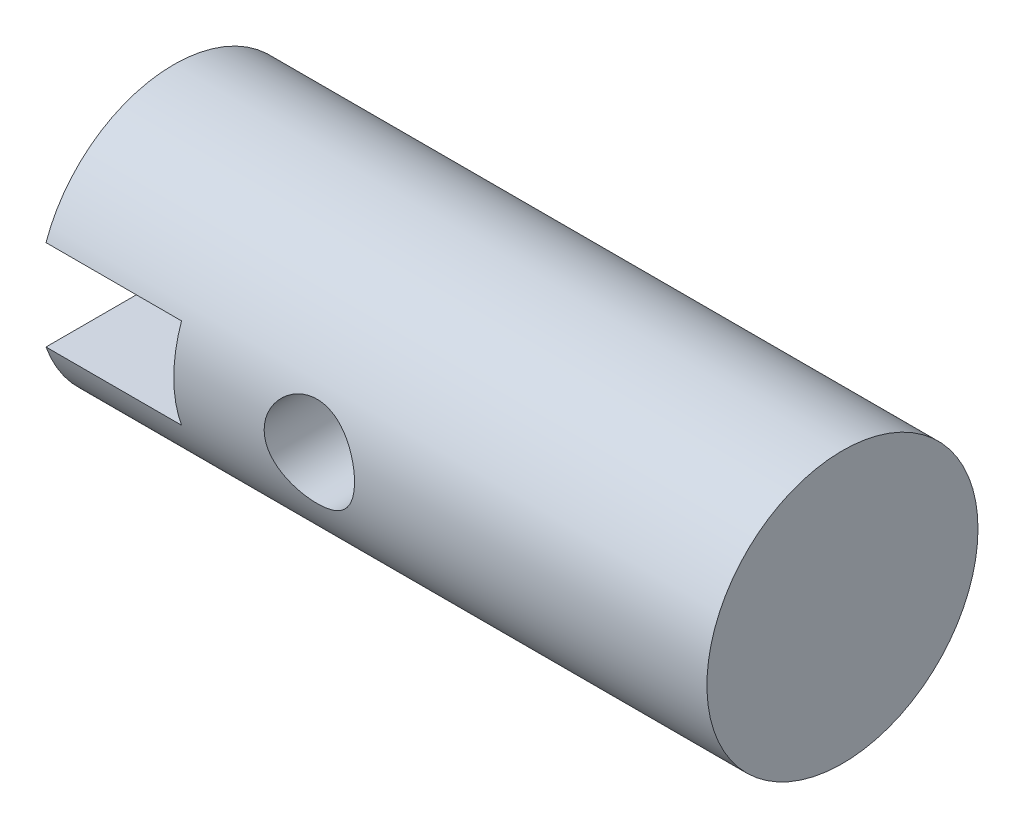
ISO-10303-21;
HEADER;
FILE_DESCRIPTION(('STEP AP214'),'2;1');
FILE_NAME('part.step','',(''),(''),'','','');
FILE_SCHEMA(('AUTOMOTIVE_DESIGN { 1 0 10303 214 1 1 1 1 }'));
ENDSEC;
DATA;
#1=APPLICATION_CONTEXT('core data for automotive mechanical design processes');
#2=APPLICATION_PROTOCOL_DEFINITION('international standard','automotive_design',2000,#1);
#3=PRODUCT_CONTEXT('',#1,'mechanical');
#4=PRODUCT('Part','Part','',(#3));
#5=PRODUCT_RELATED_PRODUCT_CATEGORY('part','',(#4));
#6=PRODUCT_DEFINITION_FORMATION('','',#4);
#7=PRODUCT_DEFINITION_CONTEXT('part definition',#1,'design');
#8=PRODUCT_DEFINITION('design','',#6,#7);
#9=PRODUCT_DEFINITION_SHAPE('','',#8);
#10=(LENGTH_UNIT() NAMED_UNIT(*) SI_UNIT(.MILLI.,.METRE.));
#11=(NAMED_UNIT(*) PLANE_ANGLE_UNIT() SI_UNIT($,.RADIAN.));
#12=(NAMED_UNIT(*) SI_UNIT($,.STERADIAN.) SOLID_ANGLE_UNIT());
#13=UNCERTAINTY_MEASURE_WITH_UNIT(LENGTH_MEASURE(1.E-05),#10,'distance_accuracy_value','');
#14=(GEOMETRIC_REPRESENTATION_CONTEXT(3) GLOBAL_UNCERTAINTY_ASSIGNED_CONTEXT((#13)) GLOBAL_UNIT_ASSIGNED_CONTEXT((#10,
#11,#12)) REPRESENTATION_CONTEXT('',''));
#15=CARTESIAN_POINT('',(0.,0.,0.));
#16=DIRECTION('',(0.,0.,1.));
#17=DIRECTION('',(1.,0.,0.));
#18=AXIS2_PLACEMENT_3D('',#15,#16,#17);
#19=CARTESIAN_POINT('',(0.,0.,0.));
#20=DIRECTION('',(1.,0.,0.));
#21=DIRECTION('',(0.,0.,-1.));
#22=AXIS2_PLACEMENT_3D('',#19,#20,#21);
#23=PLANE('',#22);
#24=CARTESIAN_POINT('',(0.,0.,0.));
#25=DIRECTION('',(1.,0.,0.));
#26=DIRECTION('',(0.,0.,-1.));
#27=AXIS2_PLACEMENT_3D('',#24,#25,#26);
#28=CIRCLE('',#27,9.525);
#29=CARTESIAN_POINT('',(0.,3.175,-8.98025612106915));
#30=VERTEX_POINT('',#29);
#31=CARTESIAN_POINT('',(0.,3.175,8.98025612106914));
#32=VERTEX_POINT('',#31);
#33=EDGE_CURVE('E166',#30,#32,#28,.T.);
#34=ORIENTED_EDGE('',*,*,#33,.F.);
#35=DIRECTION('',(0.,0.,1.));
#36=VECTOR('',#35,1.);
#37=CARTESIAN_POINT('',(0.,3.175,0.));
#38=LINE('',#37,#36);
#39=EDGE_CURVE('E187',#30,#32,#38,.T.);
#40=ORIENTED_EDGE('',*,*,#39,.T.);
#41=EDGE_LOOP('',(#34,#40));
#42=FACE_BOUND('',#41,.T.);
#43=ADVANCED_FACE('F25',(#42),#23,.F.);
#44=CARTESIAN_POINT('',(46.99,0.,0.));
#45=DIRECTION('',(-1.,0.,0.));
#46=DIRECTION('',(0.,0.,1.));
#47=AXIS2_PLACEMENT_3D('',#44,#45,#46);
#48=CYLINDRICAL_SURFACE('',#47,9.525);
#49=CARTESIAN_POINT('',(22.225,0.,9.525));
#50=CARTESIAN_POINT('',(22.225000805598,-0.173238677165346,9.52500048580498));
#51=CARTESIAN_POINT('',(22.2107751550461,-0.346472492659896,9.52023018186455));
#52=CARTESIAN_POINT('',(22.1544225795053,-0.687837590771687,9.50167042395416));
#53=CARTESIAN_POINT('',(22.1122927579622,-0.855968341777246,9.48788003366834));
#54=CARTESIAN_POINT('',(22.0017364022556,-1.18215660666814,9.45277852602955));
#55=CARTESIAN_POINT('',(21.9333538266918,-1.34023044718816,9.43147998545459));
#56=CARTESIAN_POINT('',(21.7724317762382,-1.6426654243569,9.3835361515256));
#57=CARTESIAN_POINT('',(21.6798875361167,-1.78702384834389,9.35688980370195));
#58=CARTESIAN_POINT('',(21.4699030695735,-2.06292981819569,9.30002249856541));
#59=CARTESIAN_POINT('',(21.3517758312229,-2.19393674844713,9.26971591772517));
#60=CARTESIAN_POINT('',(21.0954392838067,-2.43469379932911,9.20941499436411));
#61=CARTESIAN_POINT('',(20.957225564102,-2.54443923892904,9.17942072197493));
#62=CARTESIAN_POINT('',(20.6597722592512,-2.74264419157345,9.12219830615344));
#63=CARTESIAN_POINT('',(20.5000423763505,-2.83040092485177,9.0950744970031));
#64=CARTESIAN_POINT('',(20.1670409000941,-2.97757492456176,9.04796594704059));
#65=CARTESIAN_POINT('',(19.9937734580083,-3.03700083920298,9.02797902810367));
#66=CARTESIAN_POINT('',(19.6447625217479,-3.12379824029159,8.99830887880273));
#67=CARTESIAN_POINT('',(19.4692993630472,-3.15218269826287,8.98830104068516));
#68=CARTESIAN_POINT('',(19.1158375805551,-3.17925806658696,8.97876209798686));
#69=CARTESIAN_POINT('',(18.9378397572483,-3.17795815259498,8.97922775597168));
#70=CARTESIAN_POINT('',(18.5930011983402,-3.14648819425835,8.99029872650972));
#71=CARTESIAN_POINT('',(18.4260223207321,-3.11764017430521,9.00043970379417));
#72=CARTESIAN_POINT('',(18.0994258927483,-3.0340495670469,9.02895888275449));
#73=CARTESIAN_POINT('',(17.9398092262437,-2.97930387942919,9.04733807064542));
#74=CARTESIAN_POINT('',(17.6294645200471,-2.84460650934117,9.09059367841715));
#75=CARTESIAN_POINT('',(17.4789210191343,-2.76426310464556,9.11556996393148));
#76=CARTESIAN_POINT('',(17.1930348662119,-2.58092291251246,9.16916373477931));
#77=CARTESIAN_POINT('',(17.0576966219865,-2.47791958175572,9.19778227084722));
#78=CARTESIAN_POINT('',(16.7986341758396,-2.2458341312661,9.25726270107577));
#79=CARTESIAN_POINT('',(16.6758851949337,-2.11567125149229,9.28816371201626));
#80=CARTESIAN_POINT('',(16.4537032283437,-1.83622813465495,9.34742029378842));
#81=CARTESIAN_POINT('',(16.3542724788277,-1.68694606622309,9.37577562033364));
#82=CARTESIAN_POINT('',(16.1807642467537,-1.3714336714219,9.42711817702495));
#83=CARTESIAN_POINT('',(16.1069480649932,-1.20504990262187,9.45004936275525));
#84=CARTESIAN_POINT('',(15.9886549226906,-0.861279339682313,9.4875530068358));
#85=CARTESIAN_POINT('',(15.9441677705306,-0.68389639114198,9.50212836854242));
#86=CARTESIAN_POINT('',(15.887523260379,-0.331418658755542,9.52079715951823));
#87=CARTESIAN_POINT('',(15.8740481058765,-0.156557979570889,9.52531755822087));
#88=CARTESIAN_POINT('',(15.8760562386751,0.192960847123751,9.52464766056077));
#89=CARTESIAN_POINT('',(15.8915346379361,0.367619023839887,9.51945900331475));
#90=CARTESIAN_POINT('',(15.9499678070617,0.706500575516009,9.50023578476806));
#91=CARTESIAN_POINT('',(15.9921137042071,0.870879661700626,9.48646180908036));
#92=CARTESIAN_POINT('',(16.1016741861819,1.19016766849014,9.45171613685472));
#93=CARTESIAN_POINT('',(16.1690919933102,1.34507537851482,9.43074352248193));
#94=CARTESIAN_POINT('',(16.3292486210945,1.64556534104864,9.38304356837145));
#95=CARTESIAN_POINT('',(16.4226068336741,1.79079512051444,9.35617936849621));
#96=CARTESIAN_POINT('',(16.6312664262928,2.06395583568049,9.29974181184133));
#97=CARTESIAN_POINT('',(16.7465745079009,2.19188146775095,9.27016762910403));
#98=CARTESIAN_POINT('',(17.0020575344459,2.432851712285,9.20993992337912));
#99=CARTESIAN_POINT('',(17.1431242954928,2.54495607735532,9.17929841452584));
#100=CARTESIAN_POINT('',(17.4427247277996,2.74401763337735,9.121774152107));
#101=CARTESIAN_POINT('',(17.6012585446632,2.83097461468096,9.09489142987857));
#102=CARTESIAN_POINT('',(17.9313618235454,2.97687025407194,9.04819093937643));
#103=CARTESIAN_POINT('',(18.1029041013608,3.03586556962394,9.02835890517708));
#104=CARTESIAN_POINT('',(18.4543022138901,3.12386556696095,8.99829392572977));
#105=CARTESIAN_POINT('',(18.6341542651588,3.15288375947876,8.98805665630055));
#106=CARTESIAN_POINT('',(18.9871257799299,3.17905219686556,8.97883201925513));
#107=CARTESIAN_POINT('',(19.1601164304107,3.17776306695417,8.97929370817293));
#108=CARTESIAN_POINT('',(19.5032791128776,3.1471942816996,8.99005281690779));
#109=CARTESIAN_POINT('',(19.6734513120074,3.11791629228101,9.00034965132723));
#110=CARTESIAN_POINT('',(20.0029307300328,3.03330550668567,9.02920864668031));
#111=CARTESIAN_POINT('',(20.1623829193893,2.97847812359926,9.04761011221366));
#112=CARTESIAN_POINT('',(20.469947017029,2.84473448628719,9.09054566248638));
#113=CARTESIAN_POINT('',(20.6180563990219,2.76581288515833,9.11508110823773));
#114=CARTESIAN_POINT('',(20.9057356520052,2.58210269895239,9.16885482792697));
#115=CARTESIAN_POINT('',(21.0446508935274,2.47633567077754,9.19825159463785));
#116=CARTESIAN_POINT('',(21.3032651574948,2.24359115395569,9.25777156199328));
#117=CARTESIAN_POINT('',(21.4229587278096,2.11660766813346,9.28789496596782));
#118=CARTESIAN_POINT('',(21.6444335090181,1.83909194322319,9.34688346918603));
#119=CARTESIAN_POINT('',(21.7453348041094,1.68783480536164,9.3756537721899));
#120=CARTESIAN_POINT('',(21.9201696116008,1.36955960976604,9.42740021973043));
#121=CARTESIAN_POINT('',(21.9941100183025,1.20254559507021,9.45037784507677));
#122=CARTESIAN_POINT('',(22.1098161831515,0.865167329863101,9.4870751034262));
#123=CARTESIAN_POINT('',(22.1528718303862,0.6952861306226,9.50116249441509));
#124=CARTESIAN_POINT('',(22.2104593911499,0.350267320832535,9.52012342428904));
#125=CARTESIAN_POINT('',(22.2249991856015,0.17513117618077,9.52499950888798));
#126=CARTESIAN_POINT('',(22.225,0.,9.525));
#127=B_SPLINE_CURVE_WITH_KNOTS('',3,(#49,#50,#51,#52,#53,#54,#55,#56,#57,#58,#59,#60,#61,#62,
#63,#64,#65,#66,#67,#68,#69,#70,#71,#72,#73,#74,#75,#76,#77,#78,#79,#80,#81,#82,#83,#84,#85,#86,
#87,#88,#89,#90,#91,#92,#93,#94,#95,#96,#97,#98,#99,#100,#101,#102,#103,#104,#105,#106,#107,
#108,#109,#110,#111,#112,#113,#114,#115,#116,#117,#118,#119,#120,#121,#122,#123,#124,#125,#126),
.UNSPECIFIED.,.T.,.F.,(4,2,2,2,2,2,2,2,2,2,2,2,2,2,2,2,2,2,2,2,2,2,2,2,2,2,2,2,2,2,2,2,2,2,2,2,
2,2,4),(0.,0.519071561632585,1.03819701322438,1.55645698636312,2.07481924951214,2.6093637259775,
3.14402575687908,3.69406121814518,4.24392866899745,4.77526114230342,5.30642937910265,
5.81332424300314,6.32027980466154,6.83539943417539,7.35066800622307,7.89283745951089,
8.43505888444012,8.98265937939884,9.53006948685135,10.0537512658116,10.5773446429626,
11.0857715158083,11.5942632377703,12.1161301950386,12.638156741095,13.1839024764639,
13.7296527614611,14.2742924389999,14.8186865394104,15.3351123975402,15.8515075194061,
16.3580948898032,16.8647947620873,17.3936046174648,17.92256420318,18.4721392315144,
19.0215736265905,19.5464607283686,20.0712027467109),.UNSPECIFIED.);
#128=CARTESIAN_POINT('',(22.225,0.,9.525));
#129=VERTEX_POINT('',#128);
#130=EDGE_CURVE('E91',#129,#129,#127,.T.);
#131=ORIENTED_EDGE('',*,*,#130,.T.);
#132=EDGE_LOOP('',(#131));
#133=FACE_BOUND('',#132,.T.);
#134=CARTESIAN_POINT('',(22.225,0.,-9.525));
#135=CARTESIAN_POINT('',(22.225000805598,0.173238677165346,-9.52500048580498));
#136=CARTESIAN_POINT('',(22.2107751550461,0.346472492659896,-9.52023018186455));
#137=CARTESIAN_POINT('',(22.1544225795053,0.687837590771686,-9.50167042395416));
#138=CARTESIAN_POINT('',(22.1122927579622,0.855968341777245,-9.48788003366834));
#139=CARTESIAN_POINT('',(22.0017364022556,1.18215660666814,-9.45277852602955));
#140=CARTESIAN_POINT('',(21.9333538266918,1.34023044718816,-9.43147998545459));
#141=CARTESIAN_POINT('',(21.7724317762382,1.6426654243569,-9.3835361515256));
#142=CARTESIAN_POINT('',(21.6798875361167,1.78702384834389,-9.35688980370195));
#143=CARTESIAN_POINT('',(21.4699030695735,2.06292981819569,-9.30002249856541));
#144=CARTESIAN_POINT('',(21.3517758312229,2.19393674844713,-9.26971591772517));
#145=CARTESIAN_POINT('',(21.0954392838067,2.43469379932911,-9.20941499436411));
#146=CARTESIAN_POINT('',(20.957225564102,2.54443923892904,-9.17942072197493));
#147=CARTESIAN_POINT('',(20.6597722592512,2.74264419157345,-9.12219830615344));
#148=CARTESIAN_POINT('',(20.5000423763505,2.83040092485177,-9.0950744970031));
#149=CARTESIAN_POINT('',(20.1670409000941,2.97757492456176,-9.04796594704059));
#150=CARTESIAN_POINT('',(19.9937734580083,3.03700083920298,-9.02797902810367));
#151=CARTESIAN_POINT('',(19.6447625217479,3.12379824029159,-8.99830887880273));
#152=CARTESIAN_POINT('',(19.4692993630472,3.15218269826287,-8.98830104068516));
#153=CARTESIAN_POINT('',(19.1158375805551,3.17925806658696,-8.97876209798686));
#154=CARTESIAN_POINT('',(18.9378397572483,3.17795815259498,-8.97922775597168));
#155=CARTESIAN_POINT('',(18.5930011983402,3.14648819425835,-8.99029872650972));
#156=CARTESIAN_POINT('',(18.4260223207321,3.11764017430521,-9.00043970379417));
#157=CARTESIAN_POINT('',(18.0994258927483,3.0340495670469,-9.02895888275449));
#158=CARTESIAN_POINT('',(17.9398092262437,2.97930387942919,-9.04733807064542));
#159=CARTESIAN_POINT('',(17.6294645200471,2.84460650934117,-9.09059367841715));
#160=CARTESIAN_POINT('',(17.4789210191343,2.76426310464556,-9.11556996393148));
#161=CARTESIAN_POINT('',(17.1930348662119,2.58092291251246,-9.16916373477931));
#162=CARTESIAN_POINT('',(17.0576966219865,2.47791958175572,-9.19778227084722));
#163=CARTESIAN_POINT('',(16.7986341758396,2.2458341312661,-9.25726270107577));
#164=CARTESIAN_POINT('',(16.6758851949337,2.11567125149229,-9.28816371201626));
#165=CARTESIAN_POINT('',(16.4537032283437,1.83622813465495,-9.34742029378842));
#166=CARTESIAN_POINT('',(16.3542724788277,1.68694606622309,-9.37577562033364));
#167=CARTESIAN_POINT('',(16.1807642467537,1.3714336714219,-9.42711817702495));
#168=CARTESIAN_POINT('',(16.1069480649932,1.20504990262187,-9.45004936275525));
#169=CARTESIAN_POINT('',(15.9886549226906,0.861279339682313,-9.4875530068358));
#170=CARTESIAN_POINT('',(15.9441677705306,0.683896391141979,-9.50212836854242));
#171=CARTESIAN_POINT('',(15.887523260379,0.331418658755542,-9.52079715951823));
#172=CARTESIAN_POINT('',(15.8740481058765,0.156557979570889,-9.52531755822087));
#173=CARTESIAN_POINT('',(15.8760562386751,-0.192960847123751,-9.52464766056077));
#174=CARTESIAN_POINT('',(15.8915346379361,-0.367619023839888,-9.51945900331475));
#175=CARTESIAN_POINT('',(15.9499678070617,-0.706500575516009,-9.50023578476806));
#176=CARTESIAN_POINT('',(15.9921137042071,-0.870879661700626,-9.48646180908036));
#177=CARTESIAN_POINT('',(16.1016741861819,-1.19016766849014,-9.45171613685472));
#178=CARTESIAN_POINT('',(16.1690919933102,-1.34507537851482,-9.43074352248193));
#179=CARTESIAN_POINT('',(16.3292486210945,-1.64556534104864,-9.38304356837145));
#180=CARTESIAN_POINT('',(16.4226068336741,-1.79079512051444,-9.35617936849621));
#181=CARTESIAN_POINT('',(16.6312664262928,-2.06395583568049,-9.29974181184133));
#182=CARTESIAN_POINT('',(16.7465745079009,-2.19188146775095,-9.27016762910403));
#183=CARTESIAN_POINT('',(17.0020575344459,-2.432851712285,-9.20993992337912));
#184=CARTESIAN_POINT('',(17.1431242954928,-2.54495607735532,-9.17929841452584));
#185=CARTESIAN_POINT('',(17.4427247277996,-2.74401763337735,-9.121774152107));
#186=CARTESIAN_POINT('',(17.6012585446632,-2.83097461468096,-9.09489142987857));
#187=CARTESIAN_POINT('',(17.9313618235454,-2.97687025407194,-9.04819093937643));
#188=CARTESIAN_POINT('',(18.1029041013608,-3.03586556962394,-9.02835890517708));
#189=CARTESIAN_POINT('',(18.4543022138901,-3.12386556696095,-8.99829392572977));
#190=CARTESIAN_POINT('',(18.6341542651588,-3.15288375947876,-8.98805665630055));
#191=CARTESIAN_POINT('',(18.9871257799299,-3.17905219686556,-8.97883201925513));
#192=CARTESIAN_POINT('',(19.1601164304107,-3.17776306695417,-8.97929370817293));
#193=CARTESIAN_POINT('',(19.5032791128776,-3.1471942816996,-8.99005281690779));
#194=CARTESIAN_POINT('',(19.6734513120074,-3.11791629228101,-9.00034965132723));
#195=CARTESIAN_POINT('',(20.0029307300328,-3.03330550668567,-9.02920864668031));
#196=CARTESIAN_POINT('',(20.1623829193893,-2.97847812359926,-9.04761011221366));
#197=CARTESIAN_POINT('',(20.469947017029,-2.84473448628719,-9.09054566248638));
#198=CARTESIAN_POINT('',(20.6180563990219,-2.76581288515833,-9.11508110823773));
#199=CARTESIAN_POINT('',(20.9057356520052,-2.58210269895239,-9.16885482792697));
#200=CARTESIAN_POINT('',(21.0446508935274,-2.47633567077754,-9.19825159463785));
#201=CARTESIAN_POINT('',(21.3032651574948,-2.24359115395568,-9.25777156199328));
#202=CARTESIAN_POINT('',(21.4229587278096,-2.11660766813345,-9.28789496596782));
#203=CARTESIAN_POINT('',(21.6444335090181,-1.83909194322318,-9.34688346918603));
#204=CARTESIAN_POINT('',(21.7453348041094,-1.68783480536164,-9.3756537721899));
#205=CARTESIAN_POINT('',(21.9201696116008,-1.36955960976603,-9.42740021973043));
#206=CARTESIAN_POINT('',(21.9941100183025,-1.20254559507021,-9.45037784507677));
#207=CARTESIAN_POINT('',(22.1098161831515,-0.865167329863098,-9.4870751034262));
#208=CARTESIAN_POINT('',(22.1528718303862,-0.695286130622597,-9.50116249441509));
#209=CARTESIAN_POINT('',(22.2104593911499,-0.350267320832534,-9.52012342428904));
#210=CARTESIAN_POINT('',(22.2249991856015,-0.17513117618077,-9.52499950888798));
#211=CARTESIAN_POINT('',(22.225,0.,-9.525));
#212=B_SPLINE_CURVE_WITH_KNOTS('',3,(#134,#135,#136,#137,#138,#139,#140,#141,#142,#143,#144,
#145,#146,#147,#148,#149,#150,#151,#152,#153,#154,#155,#156,#157,#158,#159,#160,#161,#162,#163,
#164,#165,#166,#167,#168,#169,#170,#171,#172,#173,#174,#175,#176,#177,#178,#179,#180,#181,#182,
#183,#184,#185,#186,#187,#188,#189,#190,#191,#192,#193,#194,#195,#196,#197,#198,#199,#200,#201,
#202,#203,#204,#205,#206,#207,#208,#209,#210,#211),.UNSPECIFIED.,.T.,.F.,(4,2,2,2,2,2,2,2,2,2,2,
2,2,2,2,2,2,2,2,2,2,2,2,2,2,2,2,2,2,2,2,2,2,2,2,2,2,2,4),(0.,0.519071561632585,1.03819701322438,
1.55645698636312,2.07481924951214,2.6093637259775,3.14402575687908,3.69406121814518,
4.24392866899746,4.77526114230342,5.30642937910265,5.81332424300314,6.32027980466154,
6.83539943417539,7.35066800622307,7.89283745951089,8.43505888444012,8.98265937939884,
9.53006948685135,10.0537512658116,10.5773446429626,11.0857715158083,11.5942632377703,
12.1161301950386,12.638156741095,13.1839024764639,13.7296527614611,14.274292439,
14.8186865394104,15.3351123975402,15.8515075194062,16.3580948898032,16.8647947620873,
17.3936046174648,17.92256420318,18.4721392315144,19.0215736265905,19.5464607283686,
20.0712027467109),.UNSPECIFIED.);
#213=CARTESIAN_POINT('',(22.225,0.,-9.525));
#214=VERTEX_POINT('',#213);
#215=EDGE_CURVE('E127',#214,#214,#212,.T.);
#216=ORIENTED_EDGE('',*,*,#215,.T.);
#217=EDGE_LOOP('',(#216));
#218=FACE_BOUND('',#217,.T.);
#219=CARTESIAN_POINT('',(46.99,0.,0.));
#220=DIRECTION('',(1.,0.,0.));
#221=DIRECTION('',(0.,0.,-1.));
#222=AXIS2_PLACEMENT_3D('',#219,#220,#221);
#223=CIRCLE('',#222,9.525);
#224=CARTESIAN_POINT('',(46.99,0.,-9.525));
#225=VERTEX_POINT('',#224);
#226=EDGE_CURVE('E174',#225,#225,#223,.T.);
#227=ORIENTED_EDGE('',*,*,#226,.F.);
#228=EDGE_LOOP('',(#227));
#229=FACE_BOUND('',#228,.T.);
#230=CARTESIAN_POINT('',(9.525,0.,0.));
#231=DIRECTION('',(1.,0.,0.));
#232=DIRECTION('',(0.,0.,-1.));
#233=AXIS2_PLACEMENT_3D('',#230,#231,#232);
#234=CIRCLE('',#233,9.525);
#235=CARTESIAN_POINT('',(9.525,-3.175,-8.98025612106915));
#236=VERTEX_POINT('',#235);
#237=CARTESIAN_POINT('',(9.525,3.175,-8.98025612106915));
#238=VERTEX_POINT('',#237);
#239=EDGE_CURVE('E13',#236,#238,#234,.T.);
#240=ORIENTED_EDGE('',*,*,#239,.T.);
#241=DIRECTION('',(-1.,0.,0.));
#242=VECTOR('',#241,1.);
#243=CARTESIAN_POINT('',(46.99,3.175,-8.98025612106915));
#244=LINE('',#243,#242);
#245=EDGE_CURVE('E167',#238,#30,#244,.T.);
#246=ORIENTED_EDGE('',*,*,#245,.T.);
#247=ORIENTED_EDGE('',*,*,#33,.T.);
#248=DIRECTION('',(-1.,0.,0.));
#249=VECTOR('',#248,1.);
#250=CARTESIAN_POINT('',(46.99,3.175,8.98025612106915));
#251=LINE('',#250,#249);
#252=CARTESIAN_POINT('',(9.525,3.175,8.98025612106915));
#253=VERTEX_POINT('',#252);
#254=EDGE_CURVE('E104',#32,#253,#251,.F.);
#255=ORIENTED_EDGE('',*,*,#254,.T.);
#256=CARTESIAN_POINT('',(9.525,-3.175,8.98025612106914));
#257=VERTEX_POINT('',#256);
#258=EDGE_CURVE('E30',#253,#257,#234,.T.);
#259=ORIENTED_EDGE('',*,*,#258,.T.);
#260=DIRECTION('',(-1.,0.,0.));
#261=VECTOR('',#260,1.);
#262=CARTESIAN_POINT('',(46.99,-3.175,8.98025612106915));
#263=LINE('',#262,#261);
#264=CARTESIAN_POINT('',(0.,-3.175,8.98025612106914));
#265=VERTEX_POINT('',#264);
#266=EDGE_CURVE('E89',#257,#265,#263,.T.);
#267=ORIENTED_EDGE('',*,*,#266,.T.);
#268=CARTESIAN_POINT('',(0.,-3.175,-8.98025612106915));
#269=VERTEX_POINT('',#268);
#270=EDGE_CURVE('E95',#265,#269,#28,.T.);
#271=ORIENTED_EDGE('',*,*,#270,.T.);
#272=DIRECTION('',(-1.,0.,0.));
#273=VECTOR('',#272,1.);
#274=CARTESIAN_POINT('',(46.99,-3.175,-8.98025612106915));
#275=LINE('',#274,#273);
#276=EDGE_CURVE('E48',#269,#236,#275,.F.);
#277=ORIENTED_EDGE('',*,*,#276,.T.);
#278=EDGE_LOOP('',(#240,#246,#247,#255,#259,#267,#271,#277));
#279=FACE_BOUND('',#278,.T.);
#280=ADVANCED_FACE('F27',(#133,#218,#229,#279),#48,.T.);
#281=CARTESIAN_POINT('',(46.99,0.,0.));
#282=DIRECTION('',(1.,0.,0.));
#283=DIRECTION('',(0.,0.,-1.));
#284=AXIS2_PLACEMENT_3D('',#281,#282,#283);
#285=PLANE('',#284);
#286=ORIENTED_EDGE('',*,*,#226,.T.);
#287=EDGE_LOOP('',(#286));
#288=FACE_BOUND('',#287,.T.);
#289=ADVANCED_FACE('F152',(#288),#285,.T.);
#290=ORIENTED_EDGE('',*,*,#270,.F.);
#291=DIRECTION('',(0.,0.,-1.));
#292=VECTOR('',#291,1.);
#293=CARTESIAN_POINT('',(0.,-3.175,0.));
#294=LINE('',#293,#292);
#295=EDGE_CURVE('E164',#265,#269,#294,.T.);
#296=ORIENTED_EDGE('',*,*,#295,.T.);
#297=EDGE_LOOP('',(#290,#296));
#298=FACE_BOUND('',#297,.T.);
#299=ADVANCED_FACE('F148',(#298),#23,.F.);
#300=CARTESIAN_POINT('',(9.525,3.175,-9.525));
#301=DIRECTION('',(1.,0.,0.));
#302=DIRECTION('',(0.,0.,-1.));
#303=AXIS2_PLACEMENT_3D('',#300,#301,#302);
#304=PLANE('',#303);
#305=DIRECTION('',(0.,0.,1.));
#306=VECTOR('',#305,1.);
#307=CARTESIAN_POINT('',(9.525,3.175,-9.525));
#308=LINE('',#307,#306);
#309=EDGE_CURVE('E83',#238,#253,#308,.T.);
#310=ORIENTED_EDGE('',*,*,#309,.F.);
#311=ORIENTED_EDGE('',*,*,#239,.F.);
#312=DIRECTION('',(0.,0.,1.));
#313=VECTOR('',#312,1.);
#314=CARTESIAN_POINT('',(9.525,-3.175,-9.525));
#315=LINE('',#314,#313);
#316=EDGE_CURVE('E82',#236,#257,#315,.T.);
#317=ORIENTED_EDGE('',*,*,#316,.T.);
#318=ORIENTED_EDGE('',*,*,#258,.F.);
#319=EDGE_LOOP('',(#310,#311,#317,#318));
#320=FACE_BOUND('',#319,.T.);
#321=ADVANCED_FACE('F81',(#320),#304,.F.);
#322=CARTESIAN_POINT('',(0.,3.175,-9.525));
#323=DIRECTION('',(0.,1.,0.));
#324=DIRECTION('',(0.,0.,1.));
#325=AXIS2_PLACEMENT_3D('',#322,#323,#324);
#326=PLANE('',#325);
#327=ORIENTED_EDGE('',*,*,#309,.T.);
#328=ORIENTED_EDGE('',*,*,#254,.F.);
#329=ORIENTED_EDGE('',*,*,#39,.F.);
#330=ORIENTED_EDGE('',*,*,#245,.F.);
#331=EDGE_LOOP('',(#327,#328,#329,#330));
#332=FACE_BOUND('',#331,.T.);
#333=ADVANCED_FACE('F142',(#332),#326,.F.);
#334=CARTESIAN_POINT('',(0.,-3.175,-9.525));
#335=DIRECTION('',(0.,-1.,0.));
#336=DIRECTION('',(0.,0.,-1.));
#337=AXIS2_PLACEMENT_3D('',#334,#335,#336);
#338=PLANE('',#337);
#339=ORIENTED_EDGE('',*,*,#316,.F.);
#340=ORIENTED_EDGE('',*,*,#276,.F.);
#341=ORIENTED_EDGE('',*,*,#295,.F.);
#342=ORIENTED_EDGE('',*,*,#266,.F.);
#343=EDGE_LOOP('',(#339,#340,#341,#342));
#344=FACE_BOUND('',#343,.T.);
#345=ADVANCED_FACE('F87',(#344),#338,.F.);
#346=CARTESIAN_POINT('',(19.05,0.,-9.525));
#347=DIRECTION('',(0.,0.,1.));
#348=DIRECTION('',(1.,0.,0.));
#349=AXIS2_PLACEMENT_3D('',#346,#347,#348);
#350=CYLINDRICAL_SURFACE('',#349,3.175);
#351=ORIENTED_EDGE('',*,*,#215,.F.);
#352=EDGE_LOOP('',(#351));
#353=FACE_BOUND('',#352,.T.);
#354=ORIENTED_EDGE('',*,*,#130,.F.);
#355=EDGE_LOOP('',(#354));
#356=FACE_BOUND('',#355,.T.);
#357=ADVANCED_FACE('F133',(#353,#356),#350,.F.);
#358=CLOSED_SHELL('',(#43,#280,#289,#299,#321,#333,#345,#357));
#359=MANIFOLD_SOLID_BREP('B1',#358);
#360=ADVANCED_BREP_SHAPE_REPRESENTATION('',(#18,#359),#14);
#361=SHAPE_DEFINITION_REPRESENTATION(#9,#360);
ENDSEC;
END-ISO-10303-21;
